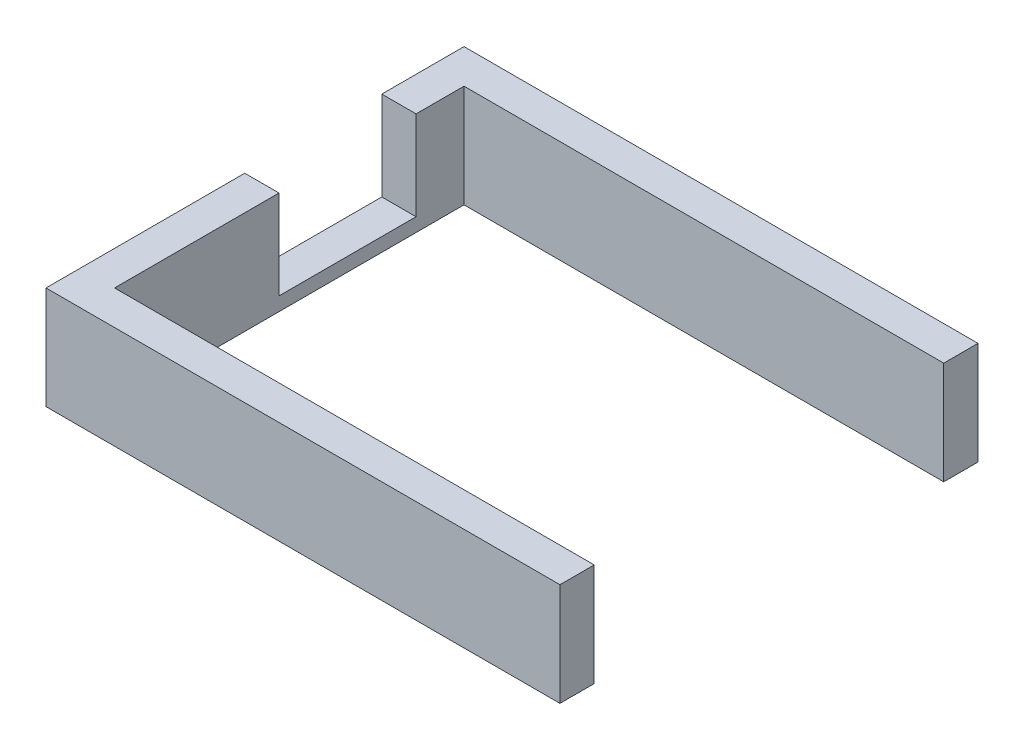
ISO-10303-21;
HEADER;
FILE_DESCRIPTION(('STEP AP214'),'2;1');
FILE_NAME('part.step','',(''),(''),'','','');
FILE_SCHEMA(('AUTOMOTIVE_DESIGN { 1 0 10303 214 1 1 1 1 }'));
ENDSEC;
DATA;
#1=APPLICATION_CONTEXT('core data for automotive mechanical design processes');
#2=APPLICATION_PROTOCOL_DEFINITION('international standard','automotive_design',2000,#1);
#3=PRODUCT_CONTEXT('',#1,'mechanical');
#4=PRODUCT('Part','Part','',(#3));
#5=PRODUCT_RELATED_PRODUCT_CATEGORY('part','',(#4));
#6=PRODUCT_DEFINITION_FORMATION('','',#4);
#7=PRODUCT_DEFINITION_CONTEXT('part definition',#1,'design');
#8=PRODUCT_DEFINITION('design','',#6,#7);
#9=PRODUCT_DEFINITION_SHAPE('','',#8);
#10=(LENGTH_UNIT() NAMED_UNIT(*) SI_UNIT(.MILLI.,.METRE.));
#11=(NAMED_UNIT(*) PLANE_ANGLE_UNIT() SI_UNIT($,.RADIAN.));
#12=(NAMED_UNIT(*) SI_UNIT($,.STERADIAN.) SOLID_ANGLE_UNIT());
#13=UNCERTAINTY_MEASURE_WITH_UNIT(LENGTH_MEASURE(1.E-05),#10,'distance_accuracy_value','');
#14=(GEOMETRIC_REPRESENTATION_CONTEXT(3) GLOBAL_UNCERTAINTY_ASSIGNED_CONTEXT((#13)) GLOBAL_UNIT_ASSIGNED_CONTEXT((#10,
#11,#12)) REPRESENTATION_CONTEXT('',''));
#15=CARTESIAN_POINT('',(0.,0.,0.));
#16=DIRECTION('',(0.,0.,1.));
#17=DIRECTION('',(1.,0.,0.));
#18=AXIS2_PLACEMENT_3D('',#15,#16,#17);
#19=CARTESIAN_POINT('',(0.,15.,0.));
#20=DIRECTION('',(0.,-1.,0.));
#21=DIRECTION('',(0.,0.,-1.));
#22=AXIS2_PLACEMENT_3D('',#19,#20,#21);
#23=PLANE('',#22);
#24=DIRECTION('',(0.,0.,-1.));
#25=VECTOR('',#24,1.);
#26=CARTESIAN_POINT('',(-35.,15.,-25.5));
#27=LINE('',#26,#25);
#28=CARTESIAN_POINT('',(-35.,15.,25.5));
#29=VERTEX_POINT('',#28);
#30=CARTESIAN_POINT('',(-35.,15.,1.5));
#31=VERTEX_POINT('',#30);
#32=EDGE_CURVE('E98',#29,#31,#27,.T.);
#33=ORIENTED_EDGE('',*,*,#32,.T.);
#34=DIRECTION('',(1.,0.,0.));
#35=VECTOR('',#34,1.);
#36=CARTESIAN_POINT('',(-40.,15.,1.5));
#37=LINE('',#36,#35);
#38=CARTESIAN_POINT('',(-40.,15.,1.5));
#39=VERTEX_POINT('',#38);
#40=EDGE_CURVE('E123',#39,#31,#37,.T.);
#41=ORIENTED_EDGE('',*,*,#40,.F.);
#42=DIRECTION('',(0.,0.,1.));
#43=VECTOR('',#42,1.);
#44=CARTESIAN_POINT('',(-40.,15.,-30.5));
#45=LINE('',#44,#43);
#46=CARTESIAN_POINT('',(-40.,15.,30.5));
#47=VERTEX_POINT('',#46);
#48=EDGE_CURVE('E116',#39,#47,#45,.T.);
#49=ORIENTED_EDGE('',*,*,#48,.T.);
#50=DIRECTION('',(1.,0.,0.));
#51=VECTOR('',#50,1.);
#52=CARTESIAN_POINT('',(-40.,15.,30.5));
#53=LINE('',#52,#51);
#54=CARTESIAN_POINT('',(35.,15.,30.5));
#55=VERTEX_POINT('',#54);
#56=EDGE_CURVE('E119',#47,#55,#53,.T.);
#57=ORIENTED_EDGE('',*,*,#56,.T.);
#58=DIRECTION('',(0.,0.,-1.));
#59=VECTOR('',#58,1.);
#60=CARTESIAN_POINT('',(35.,15.,25.5));
#61=LINE('',#60,#59);
#62=CARTESIAN_POINT('',(35.,15.,25.5));
#63=VERTEX_POINT('',#62);
#64=EDGE_CURVE('E57',#55,#63,#61,.T.);
#65=ORIENTED_EDGE('',*,*,#64,.T.);
#66=DIRECTION('',(-1.,0.,0.));
#67=VECTOR('',#66,1.);
#68=CARTESIAN_POINT('',(-35.,15.,25.5));
#69=LINE('',#68,#67);
#70=EDGE_CURVE('E163',#63,#29,#69,.T.);
#71=ORIENTED_EDGE('',*,*,#70,.T.);
#72=EDGE_LOOP('',(#33,#41,#49,#57,#65,#71));
#73=FACE_BOUND('',#72,.T.);
#74=ADVANCED_FACE('F33',(#73),#23,.F.);
#75=CARTESIAN_POINT('',(-35.,15.,25.5));
#76=DIRECTION('',(0.,0.,1.));
#77=DIRECTION('',(1.,0.,0.));
#78=AXIS2_PLACEMENT_3D('',#75,#76,#77);
#79=PLANE('',#78);
#80=DIRECTION('',(-1.,0.,0.));
#81=VECTOR('',#80,1.);
#82=CARTESIAN_POINT('',(-35.,0.,25.5));
#83=LINE('',#82,#81);
#84=CARTESIAN_POINT('',(35.,0.,25.5));
#85=VERTEX_POINT('',#84);
#86=CARTESIAN_POINT('',(-35.,0.,25.5));
#87=VERTEX_POINT('',#86);
#88=EDGE_CURVE('E147',#85,#87,#83,.T.);
#89=ORIENTED_EDGE('',*,*,#88,.T.);
#90=DIRECTION('',(0.,-1.,0.));
#91=VECTOR('',#90,1.);
#92=CARTESIAN_POINT('',(-35.,15.,25.5));
#93=LINE('',#92,#91);
#94=EDGE_CURVE('E11',#29,#87,#93,.T.);
#95=ORIENTED_EDGE('',*,*,#94,.F.);
#96=ORIENTED_EDGE('',*,*,#70,.F.);
#97=DIRECTION('',(0.,-1.,0.));
#98=VECTOR('',#97,1.);
#99=CARTESIAN_POINT('',(35.,15.,25.5));
#100=LINE('',#99,#98);
#101=EDGE_CURVE('E142',#63,#85,#100,.T.);
#102=ORIENTED_EDGE('',*,*,#101,.T.);
#103=EDGE_LOOP('',(#89,#95,#96,#102));
#104=FACE_BOUND('',#103,.T.);
#105=ADVANCED_FACE('F35',(#104),#79,.F.);
#106=CARTESIAN_POINT('',(-35.,15.,-25.5));
#107=DIRECTION('',(-1.,0.,0.));
#108=DIRECTION('',(0.,0.,1.));
#109=AXIS2_PLACEMENT_3D('',#106,#107,#108);
#110=PLANE('',#109);
#111=DIRECTION('',(0.,0.,-1.));
#112=VECTOR('',#111,1.);
#113=CARTESIAN_POINT('',(-35.,2.,-18.5));
#114=LINE('',#113,#112);
#115=CARTESIAN_POINT('',(-35.,2.,1.5));
#116=VERTEX_POINT('',#115);
#117=CARTESIAN_POINT('',(-35.,2.,-18.5));
#118=VERTEX_POINT('',#117);
#119=EDGE_CURVE('E213',#116,#118,#114,.T.);
#120=ORIENTED_EDGE('',*,*,#119,.F.);
#121=DIRECTION('',(0.,1.,0.));
#122=VECTOR('',#121,1.);
#123=CARTESIAN_POINT('',(-35.,2.,1.5));
#124=LINE('',#123,#122);
#125=EDGE_CURVE('E151',#116,#31,#124,.T.);
#126=ORIENTED_EDGE('',*,*,#125,.T.);
#127=ORIENTED_EDGE('',*,*,#32,.F.);
#128=ORIENTED_EDGE('',*,*,#94,.T.);
#129=DIRECTION('',(0.,0.,-1.));
#130=VECTOR('',#129,1.);
#131=CARTESIAN_POINT('',(-35.,0.,-25.5));
#132=LINE('',#131,#130);
#133=CARTESIAN_POINT('',(-35.,0.,-25.5));
#134=VERTEX_POINT('',#133);
#135=EDGE_CURVE('E150',#87,#134,#132,.T.);
#136=ORIENTED_EDGE('',*,*,#135,.T.);
#137=DIRECTION('',(0.,-1.,0.));
#138=VECTOR('',#137,1.);
#139=CARTESIAN_POINT('',(-35.,15.,-25.5));
#140=LINE('',#139,#138);
#141=CARTESIAN_POINT('',(-35.,15.,-25.5));
#142=VERTEX_POINT('',#141);
#143=EDGE_CURVE('E41',#142,#134,#140,.T.);
#144=ORIENTED_EDGE('',*,*,#143,.F.);
#145=CARTESIAN_POINT('',(-35.,15.,-18.5));
#146=VERTEX_POINT('',#145);
#147=EDGE_CURVE('E201',#146,#142,#27,.T.);
#148=ORIENTED_EDGE('',*,*,#147,.F.);
#149=DIRECTION('',(0.,1.,0.));
#150=VECTOR('',#149,1.);
#151=CARTESIAN_POINT('',(-35.,2.,-18.5));
#152=LINE('',#151,#150);
#153=EDGE_CURVE('E48',#118,#146,#152,.T.);
#154=ORIENTED_EDGE('',*,*,#153,.F.);
#155=EDGE_LOOP('',(#120,#126,#127,#128,#136,#144,#148,#154));
#156=FACE_BOUND('',#155,.T.);
#157=ADVANCED_FACE('F233',(#156),#110,.F.);
#158=CARTESIAN_POINT('',(-35.,15.,-25.5));
#159=DIRECTION('',(0.,0.,-1.));
#160=DIRECTION('',(-1.,0.,0.));
#161=AXIS2_PLACEMENT_3D('',#158,#159,#160);
#162=PLANE('',#161);
#163=DIRECTION('',(1.,0.,0.));
#164=VECTOR('',#163,1.);
#165=CARTESIAN_POINT('',(-35.,0.,-25.5));
#166=LINE('',#165,#164);
#167=CARTESIAN_POINT('',(35.,0.,-25.5));
#168=VERTEX_POINT('',#167);
#169=EDGE_CURVE('E153',#134,#168,#166,.T.);
#170=ORIENTED_EDGE('',*,*,#169,.T.);
#171=DIRECTION('',(0.,-1.,0.));
#172=VECTOR('',#171,1.);
#173=CARTESIAN_POINT('',(35.,15.,-25.5));
#174=LINE('',#173,#172);
#175=CARTESIAN_POINT('',(35.,15.,-25.5));
#176=VERTEX_POINT('',#175);
#177=EDGE_CURVE('E170',#176,#168,#174,.T.);
#178=ORIENTED_EDGE('',*,*,#177,.F.);
#179=DIRECTION('',(1.,0.,0.));
#180=VECTOR('',#179,1.);
#181=CARTESIAN_POINT('',(-35.,15.,-25.5));
#182=LINE('',#181,#180);
#183=EDGE_CURVE('E179',#142,#176,#182,.T.);
#184=ORIENTED_EDGE('',*,*,#183,.F.);
#185=ORIENTED_EDGE('',*,*,#143,.T.);
#186=EDGE_LOOP('',(#170,#178,#184,#185));
#187=FACE_BOUND('',#186,.T.);
#188=ADVANCED_FACE('F177',(#187),#162,.F.);
#189=CARTESIAN_POINT('',(35.,15.,-25.5));
#190=DIRECTION('',(-1.,0.,0.));
#191=DIRECTION('',(0.,0.,1.));
#192=AXIS2_PLACEMENT_3D('',#189,#190,#191);
#193=PLANE('',#192);
#194=DIRECTION('',(0.,0.,-1.));
#195=VECTOR('',#194,1.);
#196=CARTESIAN_POINT('',(35.,0.,-25.5));
#197=LINE('',#196,#195);
#198=CARTESIAN_POINT('',(35.,0.,-30.5));
#199=VERTEX_POINT('',#198);
#200=EDGE_CURVE('E155',#168,#199,#197,.T.);
#201=ORIENTED_EDGE('',*,*,#200,.T.);
#202=DIRECTION('',(0.,-1.,0.));
#203=VECTOR('',#202,1.);
#204=CARTESIAN_POINT('',(35.,15.,-30.5));
#205=LINE('',#204,#203);
#206=CARTESIAN_POINT('',(35.,15.,-30.5));
#207=VERTEX_POINT('',#206);
#208=EDGE_CURVE('E167',#207,#199,#205,.T.);
#209=ORIENTED_EDGE('',*,*,#208,.F.);
#210=DIRECTION('',(0.,0.,-1.));
#211=VECTOR('',#210,1.);
#212=CARTESIAN_POINT('',(35.,15.,-25.5));
#213=LINE('',#212,#211);
#214=EDGE_CURVE('E196',#176,#207,#213,.T.);
#215=ORIENTED_EDGE('',*,*,#214,.F.);
#216=ORIENTED_EDGE('',*,*,#177,.T.);
#217=EDGE_LOOP('',(#201,#209,#215,#216));
#218=FACE_BOUND('',#217,.T.);
#219=ADVANCED_FACE('F188',(#218),#193,.F.);
#220=CARTESIAN_POINT('',(-40.,15.,-30.5));
#221=DIRECTION('',(0.,0.,1.));
#222=DIRECTION('',(1.,0.,0.));
#223=AXIS2_PLACEMENT_3D('',#220,#221,#222);
#224=PLANE('',#223);
#225=DIRECTION('',(-1.,0.,0.));
#226=VECTOR('',#225,1.);
#227=CARTESIAN_POINT('',(-40.,0.,-30.5));
#228=LINE('',#227,#226);
#229=CARTESIAN_POINT('',(-40.,0.,-30.5));
#230=VERTEX_POINT('',#229);
#231=EDGE_CURVE('E157',#199,#230,#228,.T.);
#232=ORIENTED_EDGE('',*,*,#231,.T.);
#233=DIRECTION('',(0.,-1.,0.));
#234=VECTOR('',#233,1.);
#235=CARTESIAN_POINT('',(-40.,15.,-30.5));
#236=LINE('',#235,#234);
#237=CARTESIAN_POINT('',(-40.,15.,-30.5));
#238=VERTEX_POINT('',#237);
#239=EDGE_CURVE('E137',#238,#230,#236,.T.);
#240=ORIENTED_EDGE('',*,*,#239,.F.);
#241=DIRECTION('',(-1.,0.,0.));
#242=VECTOR('',#241,1.);
#243=CARTESIAN_POINT('',(-40.,15.,-30.5));
#244=LINE('',#243,#242);
#245=EDGE_CURVE('E127',#207,#238,#244,.T.);
#246=ORIENTED_EDGE('',*,*,#245,.F.);
#247=ORIENTED_EDGE('',*,*,#208,.T.);
#248=EDGE_LOOP('',(#232,#240,#246,#247));
#249=FACE_BOUND('',#248,.T.);
#250=ADVANCED_FACE('F192',(#249),#224,.F.);
#251=CARTESIAN_POINT('',(-40.,15.,-30.5));
#252=DIRECTION('',(1.,0.,0.));
#253=DIRECTION('',(0.,0.,-1.));
#254=AXIS2_PLACEMENT_3D('',#251,#252,#253);
#255=PLANE('',#254);
#256=ORIENTED_EDGE('',*,*,#48,.F.);
#257=DIRECTION('',(0.,1.,0.));
#258=VECTOR('',#257,1.);
#259=CARTESIAN_POINT('',(-40.,2.,1.5));
#260=LINE('',#259,#258);
#261=CARTESIAN_POINT('',(-40.,2.,1.5));
#262=VERTEX_POINT('',#261);
#263=EDGE_CURVE('E208',#262,#39,#260,.T.);
#264=ORIENTED_EDGE('',*,*,#263,.F.);
#265=DIRECTION('',(0.,0.,1.));
#266=VECTOR('',#265,1.);
#267=CARTESIAN_POINT('',(-40.,2.,-18.5));
#268=LINE('',#267,#266);
#269=CARTESIAN_POINT('',(-40.,2.,-18.5));
#270=VERTEX_POINT('',#269);
#271=EDGE_CURVE('E218',#270,#262,#268,.T.);
#272=ORIENTED_EDGE('',*,*,#271,.F.);
#273=DIRECTION('',(0.,1.,0.));
#274=VECTOR('',#273,1.);
#275=CARTESIAN_POINT('',(-40.,2.,-18.5));
#276=LINE('',#275,#274);
#277=CARTESIAN_POINT('',(-40.,15.,-18.5));
#278=VERTEX_POINT('',#277);
#279=EDGE_CURVE('E204',#270,#278,#276,.T.);
#280=ORIENTED_EDGE('',*,*,#279,.T.);
#281=EDGE_CURVE('E126',#238,#278,#45,.T.);
#282=ORIENTED_EDGE('',*,*,#281,.F.);
#283=ORIENTED_EDGE('',*,*,#239,.T.);
#284=DIRECTION('',(0.,0.,1.));
#285=VECTOR('',#284,1.);
#286=CARTESIAN_POINT('',(-40.,0.,-30.5));
#287=LINE('',#286,#285);
#288=CARTESIAN_POINT('',(-40.,0.,30.5));
#289=VERTEX_POINT('',#288);
#290=EDGE_CURVE('E134',#230,#289,#287,.T.);
#291=ORIENTED_EDGE('',*,*,#290,.T.);
#292=DIRECTION('',(0.,-1.,0.));
#293=VECTOR('',#292,1.);
#294=CARTESIAN_POINT('',(-40.,15.,30.5));
#295=LINE('',#294,#293);
#296=EDGE_CURVE('E130',#47,#289,#295,.T.);
#297=ORIENTED_EDGE('',*,*,#296,.F.);
#298=EDGE_LOOP('',(#256,#264,#272,#280,#282,#283,#291,#297));
#299=FACE_BOUND('',#298,.T.);
#300=ADVANCED_FACE('F131',(#299),#255,.F.);
#301=CARTESIAN_POINT('',(-40.,15.,30.5));
#302=DIRECTION('',(0.,0.,-1.));
#303=DIRECTION('',(-1.,0.,0.));
#304=AXIS2_PLACEMENT_3D('',#301,#302,#303);
#305=PLANE('',#304);
#306=DIRECTION('',(1.,0.,0.));
#307=VECTOR('',#306,1.);
#308=CARTESIAN_POINT('',(-40.,0.,30.5));
#309=LINE('',#308,#307);
#310=CARTESIAN_POINT('',(35.,0.,30.5));
#311=VERTEX_POINT('',#310);
#312=EDGE_CURVE('E160',#289,#311,#309,.T.);
#313=ORIENTED_EDGE('',*,*,#312,.T.);
#314=DIRECTION('',(0.,-1.,0.));
#315=VECTOR('',#314,1.);
#316=CARTESIAN_POINT('',(35.,15.,30.5));
#317=LINE('',#316,#315);
#318=EDGE_CURVE('E138',#55,#311,#317,.T.);
#319=ORIENTED_EDGE('',*,*,#318,.F.);
#320=ORIENTED_EDGE('',*,*,#56,.F.);
#321=ORIENTED_EDGE('',*,*,#296,.T.);
#322=EDGE_LOOP('',(#313,#319,#320,#321));
#323=FACE_BOUND('',#322,.T.);
#324=ADVANCED_FACE('F140',(#323),#305,.F.);
#325=CARTESIAN_POINT('',(35.,15.,25.5));
#326=DIRECTION('',(-1.,0.,0.));
#327=DIRECTION('',(0.,0.,1.));
#328=AXIS2_PLACEMENT_3D('',#325,#326,#327);
#329=PLANE('',#328);
#330=DIRECTION('',(0.,0.,-1.));
#331=VECTOR('',#330,1.);
#332=CARTESIAN_POINT('',(35.,0.,25.5));
#333=LINE('',#332,#331);
#334=EDGE_CURVE('E90',#311,#85,#333,.T.);
#335=ORIENTED_EDGE('',*,*,#334,.T.);
#336=ORIENTED_EDGE('',*,*,#101,.F.);
#337=ORIENTED_EDGE('',*,*,#64,.F.);
#338=ORIENTED_EDGE('',*,*,#318,.T.);
#339=EDGE_LOOP('',(#335,#336,#337,#338));
#340=FACE_BOUND('',#339,.T.);
#341=ADVANCED_FACE('F249',(#340),#329,.F.);
#342=ORIENTED_EDGE('',*,*,#281,.T.);
#343=DIRECTION('',(-1.,0.,0.));
#344=VECTOR('',#343,1.);
#345=CARTESIAN_POINT('',(-40.,15.,-18.5));
#346=LINE('',#345,#344);
#347=EDGE_CURVE('E214',#146,#278,#346,.T.);
#348=ORIENTED_EDGE('',*,*,#347,.F.);
#349=ORIENTED_EDGE('',*,*,#147,.T.);
#350=ORIENTED_EDGE('',*,*,#183,.T.);
#351=ORIENTED_EDGE('',*,*,#214,.T.);
#352=ORIENTED_EDGE('',*,*,#245,.T.);
#353=EDGE_LOOP('',(#342,#348,#349,#350,#351,#352));
#354=FACE_BOUND('',#353,.T.);
#355=ADVANCED_FACE('F234',(#354),#23,.F.);
#356=CARTESIAN_POINT('',(0.,0.,0.));
#357=DIRECTION('',(0.,-1.,0.));
#358=DIRECTION('',(0.,0.,-1.));
#359=AXIS2_PLACEMENT_3D('',#356,#357,#358);
#360=PLANE('',#359);
#361=ORIENTED_EDGE('',*,*,#88,.F.);
#362=ORIENTED_EDGE('',*,*,#334,.F.);
#363=ORIENTED_EDGE('',*,*,#312,.F.);
#364=ORIENTED_EDGE('',*,*,#290,.F.);
#365=ORIENTED_EDGE('',*,*,#231,.F.);
#366=ORIENTED_EDGE('',*,*,#200,.F.);
#367=ORIENTED_EDGE('',*,*,#169,.F.);
#368=ORIENTED_EDGE('',*,*,#135,.F.);
#369=EDGE_LOOP('',(#361,#362,#363,#364,#365,#366,#367,#368));
#370=FACE_BOUND('',#369,.T.);
#371=ADVANCED_FACE('F184',(#370),#360,.T.);
#372=CARTESIAN_POINT('',(-40.,2.,1.5));
#373=DIRECTION('',(0.,0.,1.));
#374=DIRECTION('',(1.,0.,0.));
#375=AXIS2_PLACEMENT_3D('',#372,#373,#374);
#376=PLANE('',#375);
#377=ORIENTED_EDGE('',*,*,#40,.T.);
#378=ORIENTED_EDGE('',*,*,#125,.F.);
#379=DIRECTION('',(1.,0.,0.));
#380=VECTOR('',#379,1.);
#381=CARTESIAN_POINT('',(-40.,2.,1.5));
#382=LINE('',#381,#380);
#383=EDGE_CURVE('E205',#262,#116,#382,.T.);
#384=ORIENTED_EDGE('',*,*,#383,.F.);
#385=ORIENTED_EDGE('',*,*,#263,.T.);
#386=EDGE_LOOP('',(#377,#378,#384,#385));
#387=FACE_BOUND('',#386,.T.);
#388=ADVANCED_FACE('F244',(#387),#376,.F.);
#389=CARTESIAN_POINT('',(-40.,2.,-18.5));
#390=DIRECTION('',(0.,0.,-1.));
#391=DIRECTION('',(-1.,0.,0.));
#392=AXIS2_PLACEMENT_3D('',#389,#390,#391);
#393=PLANE('',#392);
#394=ORIENTED_EDGE('',*,*,#347,.T.);
#395=ORIENTED_EDGE('',*,*,#279,.F.);
#396=DIRECTION('',(-1.,0.,0.));
#397=VECTOR('',#396,1.);
#398=CARTESIAN_POINT('',(-40.,2.,-18.5));
#399=LINE('',#398,#397);
#400=EDGE_CURVE('E221',#118,#270,#399,.T.);
#401=ORIENTED_EDGE('',*,*,#400,.F.);
#402=ORIENTED_EDGE('',*,*,#153,.T.);
#403=EDGE_LOOP('',(#394,#395,#401,#402));
#404=FACE_BOUND('',#403,.T.);
#405=ADVANCED_FACE('F237',(#404),#393,.F.);
#406=CARTESIAN_POINT('',(0.,2.,0.));
#407=DIRECTION('',(0.,1.,0.));
#408=DIRECTION('',(0.,0.,1.));
#409=AXIS2_PLACEMENT_3D('',#406,#407,#408);
#410=PLANE('',#409);
#411=ORIENTED_EDGE('',*,*,#119,.T.);
#412=ORIENTED_EDGE('',*,*,#400,.T.);
#413=ORIENTED_EDGE('',*,*,#271,.T.);
#414=ORIENTED_EDGE('',*,*,#383,.T.);
#415=EDGE_LOOP('',(#411,#412,#413,#414));
#416=FACE_BOUND('',#415,.T.);
#417=ADVANCED_FACE('F228',(#416),#410,.T.);
#418=CLOSED_SHELL('',(#74,#105,#157,#188,#219,#250,#300,#324,#341,#355,#371,#388,#405,#417));
#419=MANIFOLD_SOLID_BREP('B2',#418);
#420=ADVANCED_BREP_SHAPE_REPRESENTATION('',(#18,#419),#14);
#421=SHAPE_DEFINITION_REPRESENTATION(#9,#420);
ENDSEC;
END-ISO-10303-21;
